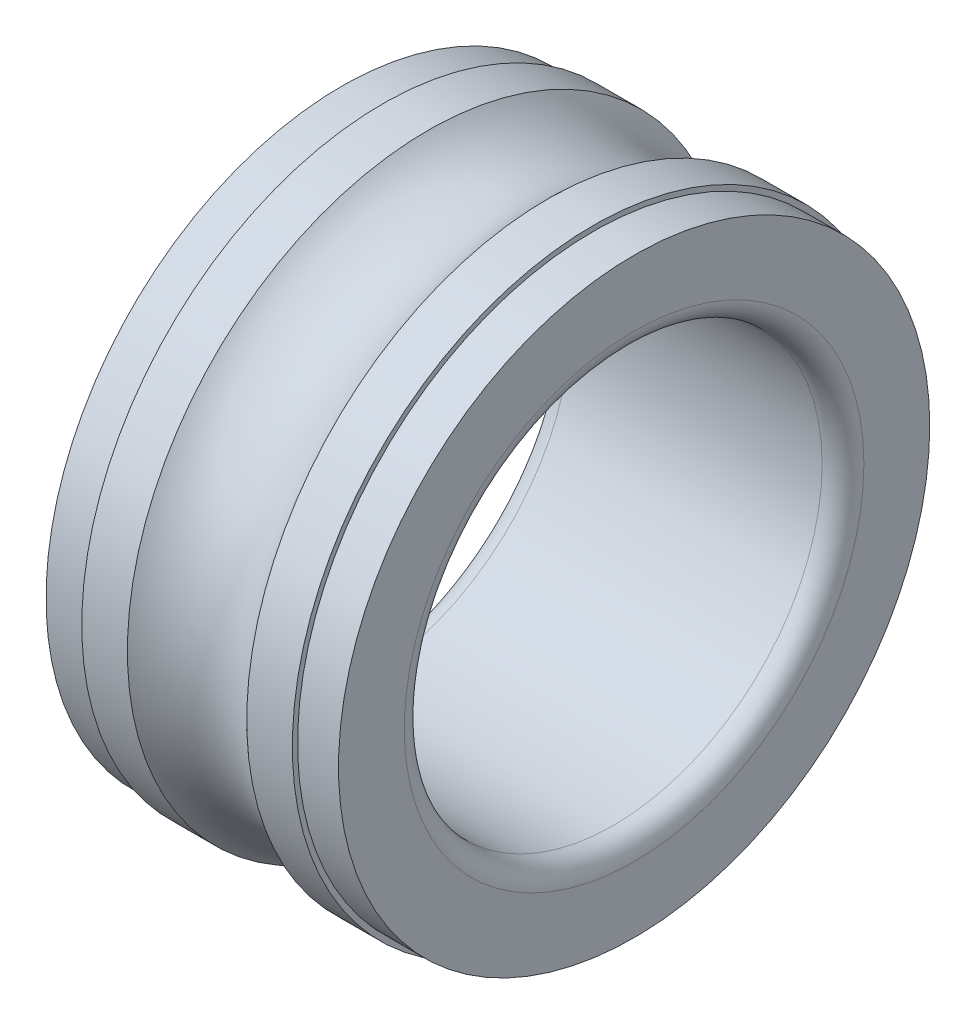
ISO-10303-21;
HEADER;
FILE_DESCRIPTION(('STEP AP214'),'2;1');
FILE_NAME('part.step','',(''),(''),'','','');
FILE_SCHEMA(('AUTOMOTIVE_DESIGN { 1 0 10303 214 1 1 1 1 }'));
ENDSEC;
DATA;
#1=APPLICATION_CONTEXT('core data for automotive mechanical design processes');
#2=APPLICATION_PROTOCOL_DEFINITION('international standard','automotive_design',2000,#1);
#3=PRODUCT_CONTEXT('',#1,'mechanical');
#4=PRODUCT('Part','Part','',(#3));
#5=PRODUCT_RELATED_PRODUCT_CATEGORY('part','',(#4));
#6=PRODUCT_DEFINITION_FORMATION('','',#4);
#7=PRODUCT_DEFINITION_CONTEXT('part definition',#1,'design');
#8=PRODUCT_DEFINITION('design','',#6,#7);
#9=PRODUCT_DEFINITION_SHAPE('','',#8);
#10=(LENGTH_UNIT() NAMED_UNIT(*) SI_UNIT(.MILLI.,.METRE.));
#11=(NAMED_UNIT(*) PLANE_ANGLE_UNIT() SI_UNIT($,.RADIAN.));
#12=(NAMED_UNIT(*) SI_UNIT($,.STERADIAN.) SOLID_ANGLE_UNIT());
#13=UNCERTAINTY_MEASURE_WITH_UNIT(LENGTH_MEASURE(1.E-05),#10,'distance_accuracy_value','');
#14=(GEOMETRIC_REPRESENTATION_CONTEXT(3) GLOBAL_UNCERTAINTY_ASSIGNED_CONTEXT((#13)) GLOBAL_UNIT_ASSIGNED_CONTEXT((#10,
#11,#12)) REPRESENTATION_CONTEXT('',''));
#15=CARTESIAN_POINT('',(0.,0.,0.));
#16=DIRECTION('',(0.,0.,1.));
#17=DIRECTION('',(1.,0.,0.));
#18=AXIS2_PLACEMENT_3D('',#15,#16,#17);
#19=CARTESIAN_POINT('',(0.,0.,0.));
#20=DIRECTION('',(1.,0.,0.));
#21=DIRECTION('',(0.,0.,-1.));
#22=AXIS2_PLACEMENT_3D('',#19,#20,#21);
#23=CYLINDRICAL_SURFACE('',#22,14.4);
#24=CARTESIAN_POINT('',(2.85657137141714,0.,0.));
#25=DIRECTION('',(1.,0.,0.));
#26=DIRECTION('',(0.,0.,-1.));
#27=AXIS2_PLACEMENT_3D('',#24,#25,#26);
#28=CIRCLE('',#27,14.4);
#29=CARTESIAN_POINT('',(2.85657137141714,0.,-14.4));
#30=VERTEX_POINT('',#29);
#31=EDGE_CURVE('E10',#30,#30,#28,.T.);
#32=ORIENTED_EDGE('',*,*,#31,.T.);
#33=EDGE_LOOP('',(#32));
#34=FACE_BOUND('',#33,.T.);
#35=CARTESIAN_POINT('',(5.04,0.,0.));
#36=DIRECTION('',(1.,0.,0.));
#37=DIRECTION('',(0.,0.,-1.));
#38=AXIS2_PLACEMENT_3D('',#35,#36,#37);
#39=CIRCLE('',#38,14.4);
#40=CARTESIAN_POINT('',(5.04,0.,-14.4));
#41=VERTEX_POINT('',#40);
#42=EDGE_CURVE('E71',#41,#41,#39,.T.);
#43=ORIENTED_EDGE('',*,*,#42,.F.);
#44=EDGE_LOOP('',(#43));
#45=FACE_BOUND('',#44,.T.);
#46=ADVANCED_FACE('F31',(#34,#45),#23,.T.);
#47=CARTESIAN_POINT('',(0.,0.,0.));
#48=DIRECTION('',(1.,0.,0.));
#49=DIRECTION('',(0.,0.,-1.));
#50=AXIS2_PLACEMENT_3D('',#47,#48,#49);
#51=TOROIDAL_SURFACE('',#50,17.2,4.);
#52=CARTESIAN_POINT('',(-2.85657137141715,0.,0.));
#53=DIRECTION('',(1.,0.,0.));
#54=DIRECTION('',(0.,0.,-1.));
#55=AXIS2_PLACEMENT_3D('',#52,#53,#54);
#56=CIRCLE('',#55,14.4);
#57=CARTESIAN_POINT('',(-2.85657137141715,0.,-14.4));
#58=VERTEX_POINT('',#57);
#59=EDGE_CURVE('E37',#58,#58,#56,.T.);
#60=ORIENTED_EDGE('',*,*,#59,.T.);
#61=EDGE_LOOP('',(#60));
#62=FACE_BOUND('',#61,.T.);
#63=ORIENTED_EDGE('',*,*,#31,.F.);
#64=EDGE_LOOP('',(#63));
#65=FACE_BOUND('',#64,.T.);
#66=ADVANCED_FACE('F79',(#62,#65),#51,.F.);
#67=CARTESIAN_POINT('',(0.,0.,0.));
#68=DIRECTION('',(1.,0.,0.));
#69=DIRECTION('',(0.,0.,-1.));
#70=AXIS2_PLACEMENT_3D('',#67,#68,#69);
#71=CYLINDRICAL_SURFACE('',#70,14.4);
#72=CARTESIAN_POINT('',(-5.04,0.,0.));
#73=DIRECTION('',(1.,0.,0.));
#74=DIRECTION('',(0.,0.,-1.));
#75=AXIS2_PLACEMENT_3D('',#72,#73,#74);
#76=CIRCLE('',#75,14.4);
#77=CARTESIAN_POINT('',(-5.04,0.,-14.4));
#78=VERTEX_POINT('',#77);
#79=EDGE_CURVE('E41',#78,#78,#76,.T.);
#80=ORIENTED_EDGE('',*,*,#79,.T.);
#81=EDGE_LOOP('',(#80));
#82=FACE_BOUND('',#81,.T.);
#83=ORIENTED_EDGE('',*,*,#59,.F.);
#84=EDGE_LOOP('',(#83));
#85=FACE_BOUND('',#84,.T.);
#86=ADVANCED_FACE('F83',(#82,#85),#71,.T.);
#87=CARTESIAN_POINT('',(-5.04,14.15,0.));
#88=DIRECTION('',(-1.,0.,0.));
#89=DIRECTION('',(0.,0.,1.));
#90=AXIS2_PLACEMENT_3D('',#87,#88,#89);
#91=PLANE('',#90);
#92=CARTESIAN_POINT('',(-5.04,0.,0.));
#93=DIRECTION('',(1.,0.,0.));
#94=DIRECTION('',(0.,0.,-1.));
#95=AXIS2_PLACEMENT_3D('',#92,#93,#94);
#96=CIRCLE('',#95,14.15);
#97=CARTESIAN_POINT('',(-5.04,0.,-14.15));
#98=VERTEX_POINT('',#97);
#99=EDGE_CURVE('E45',#98,#98,#96,.T.);
#100=ORIENTED_EDGE('',*,*,#99,.T.);
#101=EDGE_LOOP('',(#100));
#102=FACE_BOUND('',#101,.T.);
#103=ORIENTED_EDGE('',*,*,#79,.F.);
#104=EDGE_LOOP('',(#103));
#105=FACE_BOUND('',#104,.T.);
#106=ADVANCED_FACE('F87',(#102,#105),#91,.T.);
#107=CARTESIAN_POINT('',(0.,0.,0.));
#108=DIRECTION('',(1.,0.,0.));
#109=DIRECTION('',(0.,0.,-1.));
#110=AXIS2_PLACEMENT_3D('',#107,#108,#109);
#111=CYLINDRICAL_SURFACE('',#110,14.15);
#112=CARTESIAN_POINT('',(-7.,0.,0.));
#113=DIRECTION('',(1.,0.,0.));
#114=DIRECTION('',(0.,0.,-1.));
#115=AXIS2_PLACEMENT_3D('',#112,#113,#114);
#116=CIRCLE('',#115,14.15);
#117=CARTESIAN_POINT('',(-7.,0.,-14.15));
#118=VERTEX_POINT('',#117);
#119=EDGE_CURVE('E50',#118,#118,#116,.T.);
#120=ORIENTED_EDGE('',*,*,#119,.T.);
#121=EDGE_LOOP('',(#120));
#122=FACE_BOUND('',#121,.T.);
#123=ORIENTED_EDGE('',*,*,#99,.F.);
#124=EDGE_LOOP('',(#123));
#125=FACE_BOUND('',#124,.T.);
#126=ADVANCED_FACE('F94',(#122,#125),#111,.T.);
#127=CARTESIAN_POINT('',(-7.,11.,0.));
#128=DIRECTION('',(-1.,0.,0.));
#129=DIRECTION('',(0.,0.,1.));
#130=AXIS2_PLACEMENT_3D('',#127,#128,#129);
#131=PLANE('',#130);
#132=CARTESIAN_POINT('',(-7.,0.,0.));
#133=DIRECTION('',(1.,0.,0.));
#134=DIRECTION('',(0.,0.,-1.));
#135=AXIS2_PLACEMENT_3D('',#132,#133,#134);
#136=CIRCLE('',#135,11.);
#137=CARTESIAN_POINT('',(-7.,0.,-11.));
#138=VERTEX_POINT('',#137);
#139=EDGE_CURVE('E53',#138,#138,#136,.T.);
#140=ORIENTED_EDGE('',*,*,#139,.T.);
#141=EDGE_LOOP('',(#140));
#142=FACE_BOUND('',#141,.T.);
#143=ORIENTED_EDGE('',*,*,#119,.F.);
#144=EDGE_LOOP('',(#143));
#145=FACE_BOUND('',#144,.T.);
#146=ADVANCED_FACE('F98',(#142,#145),#131,.T.);
#147=CARTESIAN_POINT('',(-6.00000000000001,0.,0.));
#148=DIRECTION('',(1.,0.,0.));
#149=DIRECTION('',(0.,0.,-1.));
#150=AXIS2_PLACEMENT_3D('',#147,#148,#149);
#151=TOROIDAL_SURFACE('',#150,11.,0.999999999999997);
#152=CARTESIAN_POINT('',(-6.,0.,0.));
#153=DIRECTION('',(1.,0.,0.));
#154=DIRECTION('',(0.,0.,-1.));
#155=AXIS2_PLACEMENT_3D('',#152,#153,#154);
#156=CIRCLE('',#155,10.);
#157=CARTESIAN_POINT('',(-6.,0.,-10.));
#158=VERTEX_POINT('',#157);
#159=EDGE_CURVE('E56',#158,#158,#156,.T.);
#160=ORIENTED_EDGE('',*,*,#159,.T.);
#161=EDGE_LOOP('',(#160));
#162=FACE_BOUND('',#161,.T.);
#163=ORIENTED_EDGE('',*,*,#139,.F.);
#164=EDGE_LOOP('',(#163));
#165=FACE_BOUND('',#164,.T.);
#166=ADVANCED_FACE('F102',(#162,#165),#151,.T.);
#167=CARTESIAN_POINT('',(0.,0.,0.));
#168=DIRECTION('',(1.,0.,0.));
#169=DIRECTION('',(0.,0.,-1.));
#170=AXIS2_PLACEMENT_3D('',#167,#168,#169);
#171=CYLINDRICAL_SURFACE('',#170,10.);
#172=CARTESIAN_POINT('',(6.,0.,0.));
#173=DIRECTION('',(1.,0.,0.));
#174=DIRECTION('',(0.,0.,-1.));
#175=AXIS2_PLACEMENT_3D('',#172,#173,#174);
#176=CIRCLE('',#175,10.);
#177=CARTESIAN_POINT('',(6.,0.,-10.));
#178=VERTEX_POINT('',#177);
#179=EDGE_CURVE('E59',#178,#178,#176,.T.);
#180=ORIENTED_EDGE('',*,*,#179,.T.);
#181=EDGE_LOOP('',(#180));
#182=FACE_BOUND('',#181,.T.);
#183=ORIENTED_EDGE('',*,*,#159,.F.);
#184=EDGE_LOOP('',(#183));
#185=FACE_BOUND('',#184,.T.);
#186=ADVANCED_FACE('F106',(#182,#185),#171,.F.);
#187=CARTESIAN_POINT('',(6.,0.,0.));
#188=DIRECTION('',(1.,0.,0.));
#189=DIRECTION('',(0.,0.,-1.));
#190=AXIS2_PLACEMENT_3D('',#187,#188,#189);
#191=TOROIDAL_SURFACE('',#190,11.,0.999999999999998);
#192=CARTESIAN_POINT('',(7.,0.,0.));
#193=DIRECTION('',(1.,0.,0.));
#194=DIRECTION('',(0.,0.,-1.));
#195=AXIS2_PLACEMENT_3D('',#192,#193,#194);
#196=CIRCLE('',#195,11.);
#197=CARTESIAN_POINT('',(7.,0.,-11.));
#198=VERTEX_POINT('',#197);
#199=EDGE_CURVE('E62',#198,#198,#196,.T.);
#200=ORIENTED_EDGE('',*,*,#199,.T.);
#201=EDGE_LOOP('',(#200));
#202=FACE_BOUND('',#201,.T.);
#203=ORIENTED_EDGE('',*,*,#179,.F.);
#204=EDGE_LOOP('',(#203));
#205=FACE_BOUND('',#204,.T.);
#206=ADVANCED_FACE('F110',(#202,#205),#191,.T.);
#207=CARTESIAN_POINT('',(7.,14.15,0.));
#208=DIRECTION('',(1.,0.,0.));
#209=DIRECTION('',(0.,0.,-1.));
#210=AXIS2_PLACEMENT_3D('',#207,#208,#209);
#211=PLANE('',#210);
#212=CARTESIAN_POINT('',(7.,0.,0.));
#213=DIRECTION('',(1.,0.,0.));
#214=DIRECTION('',(0.,0.,-1.));
#215=AXIS2_PLACEMENT_3D('',#212,#213,#214);
#216=CIRCLE('',#215,14.15);
#217=CARTESIAN_POINT('',(7.,0.,-14.15));
#218=VERTEX_POINT('',#217);
#219=EDGE_CURVE('E65',#218,#218,#216,.T.);
#220=ORIENTED_EDGE('',*,*,#219,.T.);
#221=EDGE_LOOP('',(#220));
#222=FACE_BOUND('',#221,.T.);
#223=ORIENTED_EDGE('',*,*,#199,.F.);
#224=EDGE_LOOP('',(#223));
#225=FACE_BOUND('',#224,.T.);
#226=ADVANCED_FACE('F114',(#222,#225),#211,.T.);
#227=CARTESIAN_POINT('',(0.,0.,0.));
#228=DIRECTION('',(1.,0.,0.));
#229=DIRECTION('',(0.,0.,-1.));
#230=AXIS2_PLACEMENT_3D('',#227,#228,#229);
#231=CYLINDRICAL_SURFACE('',#230,14.15);
#232=CARTESIAN_POINT('',(5.04,0.,0.));
#233=DIRECTION('',(1.,0.,0.));
#234=DIRECTION('',(0.,0.,-1.));
#235=AXIS2_PLACEMENT_3D('',#232,#233,#234);
#236=CIRCLE('',#235,14.15);
#237=CARTESIAN_POINT('',(5.04,0.,-14.15));
#238=VERTEX_POINT('',#237);
#239=EDGE_CURVE('E68',#238,#238,#236,.T.);
#240=ORIENTED_EDGE('',*,*,#239,.T.);
#241=EDGE_LOOP('',(#240));
#242=FACE_BOUND('',#241,.T.);
#243=ORIENTED_EDGE('',*,*,#219,.F.);
#244=EDGE_LOOP('',(#243));
#245=FACE_BOUND('',#244,.T.);
#246=ADVANCED_FACE('F118',(#242,#245),#231,.T.);
#247=CARTESIAN_POINT('',(5.04,14.4,0.));
#248=DIRECTION('',(1.,0.,0.));
#249=DIRECTION('',(0.,0.,-1.));
#250=AXIS2_PLACEMENT_3D('',#247,#248,#249);
#251=PLANE('',#250);
#252=ORIENTED_EDGE('',*,*,#42,.T.);
#253=EDGE_LOOP('',(#252));
#254=FACE_BOUND('',#253,.T.);
#255=ORIENTED_EDGE('',*,*,#239,.F.);
#256=EDGE_LOOP('',(#255));
#257=FACE_BOUND('',#256,.T.);
#258=ADVANCED_FACE('F75',(#254,#257),#251,.T.);
#259=CLOSED_SHELL('',(#46,#66,#86,#106,#126,#146,#166,#186,#206,#226,#246,#258));
#260=MANIFOLD_SOLID_BREP('B2',#259);
#261=ADVANCED_BREP_SHAPE_REPRESENTATION('',(#18,#260),#14);
#262=SHAPE_DEFINITION_REPRESENTATION(#9,#261);
ENDSEC;
END-ISO-10303-21;
